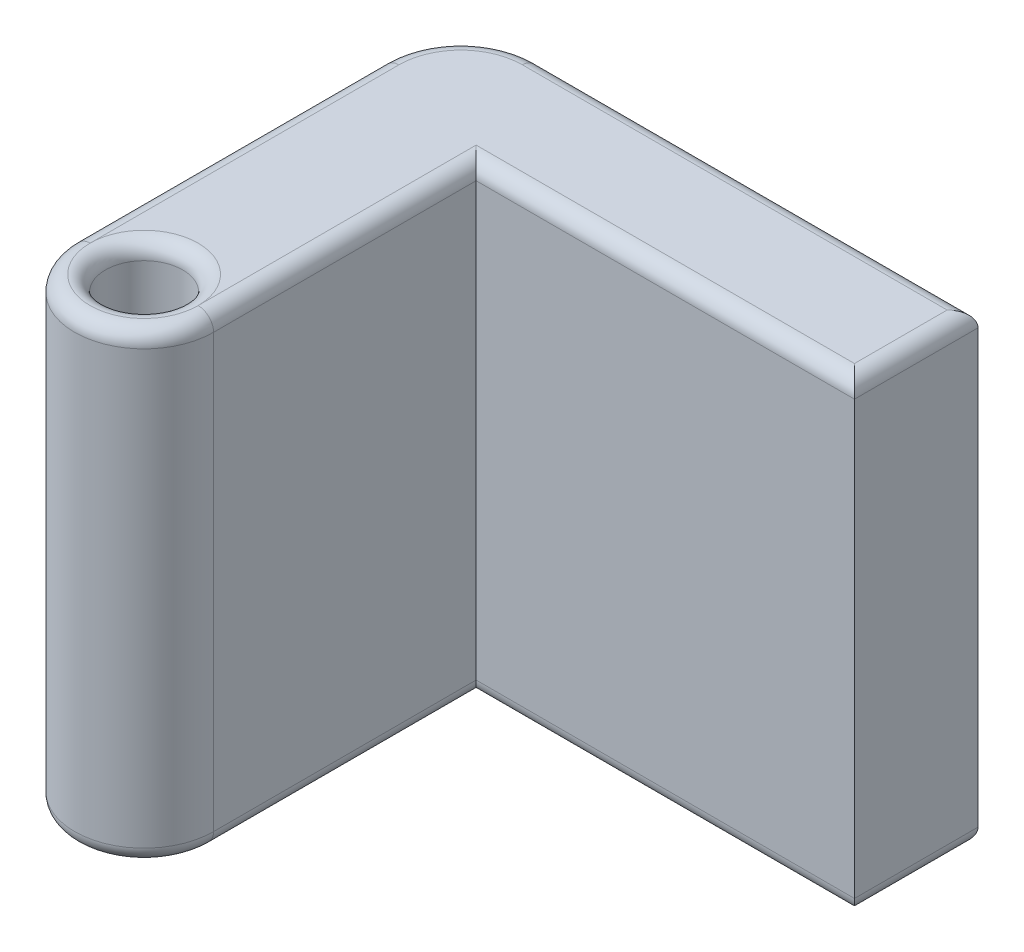
ISO-10303-21;
HEADER;
FILE_DESCRIPTION(('STEP AP214'),'2;1');
FILE_NAME('part.step','',(''),(''),'','','');
FILE_SCHEMA(('AUTOMOTIVE_DESIGN { 1 0 10303 214 1 1 1 1 }'));
ENDSEC;
DATA;
#1=APPLICATION_CONTEXT('core data for automotive mechanical design processes');
#2=APPLICATION_PROTOCOL_DEFINITION('international standard','automotive_design',2000,#1);
#3=PRODUCT_CONTEXT('',#1,'mechanical');
#4=PRODUCT('Part','Part','',(#3));
#5=PRODUCT_RELATED_PRODUCT_CATEGORY('part','',(#4));
#6=PRODUCT_DEFINITION_FORMATION('','',#4);
#7=PRODUCT_DEFINITION_CONTEXT('part definition',#1,'design');
#8=PRODUCT_DEFINITION('design','',#6,#7);
#9=PRODUCT_DEFINITION_SHAPE('','',#8);
#10=(LENGTH_UNIT() NAMED_UNIT(*) SI_UNIT(.MILLI.,.METRE.));
#11=(NAMED_UNIT(*) PLANE_ANGLE_UNIT() SI_UNIT($,.RADIAN.));
#12=(NAMED_UNIT(*) SI_UNIT($,.STERADIAN.) SOLID_ANGLE_UNIT());
#13=UNCERTAINTY_MEASURE_WITH_UNIT(LENGTH_MEASURE(1.E-05),#10,'distance_accuracy_value','');
#14=(GEOMETRIC_REPRESENTATION_CONTEXT(3) GLOBAL_UNCERTAINTY_ASSIGNED_CONTEXT((#13)) GLOBAL_UNIT_ASSIGNED_CONTEXT((#10,
#11,#12)) REPRESENTATION_CONTEXT('',''));
#15=CARTESIAN_POINT('',(0.,0.,0.));
#16=DIRECTION('',(0.,0.,1.));
#17=DIRECTION('',(1.,0.,0.));
#18=AXIS2_PLACEMENT_3D('',#15,#16,#17);
#19=CARTESIAN_POINT('',(-29.,30.,25.));
#20=DIRECTION('',(0.,1.,0.));
#21=DIRECTION('',(0.,0.,1.));
#22=AXIS2_PLACEMENT_3D('',#19,#20,#21);
#23=PLANE('',#22);
#24=CARTESIAN_POINT('',(-28.5,30.,5.));
#25=DIRECTION('',(0.,1.,0.));
#26=DIRECTION('',(0.,0.,1.));
#27=AXIS2_PLACEMENT_3D('',#24,#25,#26);
#28=CIRCLE('',#27,4.);
#29=CARTESIAN_POINT('',(-32.5,30.,5.));
#30=VERTEX_POINT('',#29);
#31=CARTESIAN_POINT('',(-28.5,30.,1.));
#32=VERTEX_POINT('',#31);
#33=EDGE_CURVE('E218',#30,#32,#28,.F.);
#34=ORIENTED_EDGE('',*,*,#33,.F.);
#35=DIRECTION('',(0.,0.,1.));
#36=VECTOR('',#35,1.);
#37=CARTESIAN_POINT('',(-32.5,30.,25.));
#38=LINE('',#37,#36);
#39=CARTESIAN_POINT('',(-32.5,30.,25.));
#40=VERTEX_POINT('',#39);
#41=EDGE_CURVE('E254',#30,#40,#38,.T.);
#42=ORIENTED_EDGE('',*,*,#41,.T.);
#43=CARTESIAN_POINT('',(-29.,30.,25.));
#44=DIRECTION('',(0.,1.,0.));
#45=DIRECTION('',(0.,0.,1.));
#46=AXIS2_PLACEMENT_3D('',#43,#44,#45);
#47=CIRCLE('',#46,3.5);
#48=CARTESIAN_POINT('',(-25.5,30.,25.));
#49=VERTEX_POINT('',#48);
#50=EDGE_CURVE('E266',#40,#49,#47,.F.);
#51=ORIENTED_EDGE('',*,*,#50,.T.);
#52=DIRECTION('',(0.,0.,-1.));
#53=VECTOR('',#52,1.);
#54=CARTESIAN_POINT('',(-25.5,30.,8.));
#55=LINE('',#54,#53);
#56=CARTESIAN_POINT('',(-25.5,30.,7.));
#57=VERTEX_POINT('',#56);
#58=EDGE_CURVE('E212',#49,#57,#55,.T.);
#59=ORIENTED_EDGE('',*,*,#58,.T.);
#60=DIRECTION('',(1.,0.,0.));
#61=VECTOR('',#60,1.);
#62=CARTESIAN_POINT('',(0.,30.,7.));
#63=LINE('',#62,#61);
#64=CARTESIAN_POINT('',(-1.,30.,7.));
#65=VERTEX_POINT('',#64);
#66=EDGE_CURVE('E258',#57,#65,#63,.T.);
#67=ORIENTED_EDGE('',*,*,#66,.T.);
#68=DIRECTION('',(0.,0.,-1.));
#69=VECTOR('',#68,1.);
#70=CARTESIAN_POINT('',(-1.,30.,0.));
#71=LINE('',#70,#69);
#72=CARTESIAN_POINT('',(-1.,30.,1.));
#73=VERTEX_POINT('',#72);
#74=EDGE_CURVE('E251',#65,#73,#71,.T.);
#75=ORIENTED_EDGE('',*,*,#74,.T.);
#76=DIRECTION('',(-1.,0.,0.));
#77=VECTOR('',#76,1.);
#78=CARTESIAN_POINT('',(-33.5,30.,1.00000000000001));
#79=LINE('',#78,#77);
#80=EDGE_CURVE('E247',#73,#32,#79,.T.);
#81=ORIENTED_EDGE('',*,*,#80,.T.);
#82=EDGE_LOOP('',(#34,#42,#51,#59,#67,#75,#81));
#83=FACE_BOUND('',#82,.T.);
#84=ADVANCED_FACE('F41',(#83),#23,.T.);
#85=CARTESIAN_POINT('',(-29.,0.,25.));
#86=DIRECTION('',(0.,1.,0.));
#87=DIRECTION('',(0.,0.,1.));
#88=AXIS2_PLACEMENT_3D('',#85,#86,#87);
#89=PLANE('',#88);
#90=CARTESIAN_POINT('',(-28.5,0.,5.));
#91=DIRECTION('',(0.,1.,0.));
#92=DIRECTION('',(0.,0.,1.));
#93=AXIS2_PLACEMENT_3D('',#90,#91,#92);
#94=CIRCLE('',#93,4.);
#95=CARTESIAN_POINT('',(-28.5,0.,1.));
#96=VERTEX_POINT('',#95);
#97=CARTESIAN_POINT('',(-32.5,0.,5.));
#98=VERTEX_POINT('',#97);
#99=EDGE_CURVE('E153',#96,#98,#94,.T.);
#100=ORIENTED_EDGE('',*,*,#99,.F.);
#101=DIRECTION('',(-1.,0.,0.));
#102=VECTOR('',#101,1.);
#103=CARTESIAN_POINT('',(-29.,0.,1.));
#104=LINE('',#103,#102);
#105=CARTESIAN_POINT('',(-1.,0.,1.));
#106=VERTEX_POINT('',#105);
#107=EDGE_CURVE('E146',#96,#106,#104,.F.);
#108=ORIENTED_EDGE('',*,*,#107,.T.);
#109=DIRECTION('',(0.,0.,-1.));
#110=VECTOR('',#109,1.);
#111=CARTESIAN_POINT('',(-1.,0.,25.));
#112=LINE('',#111,#110);
#113=CARTESIAN_POINT('',(-1.,0.,7.));
#114=VERTEX_POINT('',#113);
#115=EDGE_CURVE('E149',#106,#114,#112,.F.);
#116=ORIENTED_EDGE('',*,*,#115,.T.);
#117=DIRECTION('',(1.,0.,0.));
#118=VECTOR('',#117,1.);
#119=CARTESIAN_POINT('',(-29.,0.,7.));
#120=LINE('',#119,#118);
#121=CARTESIAN_POINT('',(-25.5,0.,7.));
#122=VERTEX_POINT('',#121);
#123=EDGE_CURVE('E168',#114,#122,#120,.F.);
#124=ORIENTED_EDGE('',*,*,#123,.T.);
#125=DIRECTION('',(0.,0.,-1.));
#126=VECTOR('',#125,1.);
#127=CARTESIAN_POINT('',(-25.5,0.,25.));
#128=LINE('',#127,#126);
#129=CARTESIAN_POINT('',(-25.5,0.,25.));
#130=VERTEX_POINT('',#129);
#131=EDGE_CURVE('E157',#122,#130,#128,.F.);
#132=ORIENTED_EDGE('',*,*,#131,.T.);
#133=CARTESIAN_POINT('',(-29.,0.,25.));
#134=DIRECTION('',(0.,1.,0.));
#135=DIRECTION('',(0.,0.,1.));
#136=AXIS2_PLACEMENT_3D('',#133,#134,#135);
#137=CIRCLE('',#136,3.5);
#138=CARTESIAN_POINT('',(-32.5,0.,25.));
#139=VERTEX_POINT('',#138);
#140=EDGE_CURVE('E156',#130,#139,#137,.T.);
#141=ORIENTED_EDGE('',*,*,#140,.T.);
#142=DIRECTION('',(0.,0.,1.));
#143=VECTOR('',#142,1.);
#144=CARTESIAN_POINT('',(-32.5,0.,25.));
#145=LINE('',#144,#143);
#146=EDGE_CURVE('E331',#139,#98,#145,.F.);
#147=ORIENTED_EDGE('',*,*,#146,.T.);
#148=EDGE_LOOP('',(#100,#108,#116,#124,#132,#141,#147));
#149=FACE_BOUND('',#148,.T.);
#150=ADVANCED_FACE('F148',(#149),#89,.F.);
#151=CARTESIAN_POINT('',(0.,30.,8.));
#152=DIRECTION('',(-1.,0.,0.));
#153=DIRECTION('',(0.,0.,1.));
#154=AXIS2_PLACEMENT_3D('',#151,#152,#153);
#155=PLANE('',#154);
#156=DIRECTION('',(0.,-1.,0.));
#157=VECTOR('',#156,1.);
#158=CARTESIAN_POINT('',(0.,30.,8.));
#159=LINE('',#158,#157);
#160=CARTESIAN_POINT('',(0.,29.,8.));
#161=VERTEX_POINT('',#160);
#162=CARTESIAN_POINT('',(0.,1.,8.));
#163=VERTEX_POINT('',#162);
#164=EDGE_CURVE('E174',#161,#163,#159,.T.);
#165=ORIENTED_EDGE('',*,*,#164,.T.);
#166=DIRECTION('',(0.,0.,-1.));
#167=VECTOR('',#166,1.);
#168=CARTESIAN_POINT('',(0.,1.,8.));
#169=LINE('',#168,#167);
#170=CARTESIAN_POINT('',(0.,1.,0.));
#171=VERTEX_POINT('',#170);
#172=EDGE_CURVE('E260',#163,#171,#169,.T.);
#173=ORIENTED_EDGE('',*,*,#172,.T.);
#174=DIRECTION('',(0.,-1.,0.));
#175=VECTOR('',#174,1.);
#176=CARTESIAN_POINT('',(0.,30.,0.));
#177=LINE('',#176,#175);
#178=CARTESIAN_POINT('',(0.,29.,0.));
#179=VERTEX_POINT('',#178);
#180=EDGE_CURVE('E169',#179,#171,#177,.T.);
#181=ORIENTED_EDGE('',*,*,#180,.F.);
#182=DIRECTION('',(0.,0.,-1.));
#183=VECTOR('',#182,1.);
#184=CARTESIAN_POINT('',(0.,29.,8.));
#185=LINE('',#184,#183);
#186=EDGE_CURVE('E298',#179,#161,#185,.F.);
#187=ORIENTED_EDGE('',*,*,#186,.T.);
#188=EDGE_LOOP('',(#165,#173,#181,#187));
#189=FACE_BOUND('',#188,.T.);
#190=ADVANCED_FACE('F311',(#189),#155,.F.);
#191=CARTESIAN_POINT('',(0.,30.,0.));
#192=DIRECTION('',(0.,0.,1.));
#193=DIRECTION('',(1.,0.,0.));
#194=AXIS2_PLACEMENT_3D('',#191,#192,#193);
#195=PLANE('',#194);
#196=DIRECTION('',(-1.,0.,0.));
#197=VECTOR('',#196,1.);
#198=CARTESIAN_POINT('',(0.,1.,0.));
#199=LINE('',#198,#197);
#200=CARTESIAN_POINT('',(-28.5,1.,0.));
#201=VERTEX_POINT('',#200);
#202=EDGE_CURVE('E172',#171,#201,#199,.T.);
#203=ORIENTED_EDGE('',*,*,#202,.T.);
#204=DIRECTION('',(0.,-1.,0.));
#205=VECTOR('',#204,1.);
#206=CARTESIAN_POINT('',(-28.5,30.,0.));
#207=LINE('',#206,#205);
#208=CARTESIAN_POINT('',(-28.5,29.,0.));
#209=VERTEX_POINT('',#208);
#210=EDGE_CURVE('E11',#201,#209,#207,.F.);
#211=ORIENTED_EDGE('',*,*,#210,.T.);
#212=DIRECTION('',(-1.,0.,0.));
#213=VECTOR('',#212,1.);
#214=CARTESIAN_POINT('',(0.,29.,0.));
#215=LINE('',#214,#213);
#216=EDGE_CURVE('E248',#209,#179,#215,.F.);
#217=ORIENTED_EDGE('',*,*,#216,.T.);
#218=ORIENTED_EDGE('',*,*,#180,.T.);
#219=EDGE_LOOP('',(#203,#211,#217,#218));
#220=FACE_BOUND('',#219,.T.);
#221=ADVANCED_FACE('F314',(#220),#195,.F.);
#222=CARTESIAN_POINT('',(-33.5,30.,0.));
#223=DIRECTION('',(1.,0.,0.));
#224=DIRECTION('',(0.,0.,-1.));
#225=AXIS2_PLACEMENT_3D('',#222,#223,#224);
#226=PLANE('',#225);
#227=DIRECTION('',(0.,0.,1.));
#228=VECTOR('',#227,1.);
#229=CARTESIAN_POINT('',(-33.5,29.,0.));
#230=LINE('',#229,#228);
#231=CARTESIAN_POINT('',(-33.5,29.,25.));
#232=VERTEX_POINT('',#231);
#233=CARTESIAN_POINT('',(-33.5,29.,5.));
#234=VERTEX_POINT('',#233);
#235=EDGE_CURVE('E346',#232,#234,#230,.F.);
#236=ORIENTED_EDGE('',*,*,#235,.T.);
#237=DIRECTION('',(0.,-1.,0.));
#238=VECTOR('',#237,1.);
#239=CARTESIAN_POINT('',(-33.5,30.,5.));
#240=LINE('',#239,#238);
#241=CARTESIAN_POINT('',(-33.5,1.,5.));
#242=VERTEX_POINT('',#241);
#243=EDGE_CURVE('E51',#234,#242,#240,.T.);
#244=ORIENTED_EDGE('',*,*,#243,.T.);
#245=DIRECTION('',(0.,0.,1.));
#246=VECTOR('',#245,1.);
#247=CARTESIAN_POINT('',(-33.5,1.,0.));
#248=LINE('',#247,#246);
#249=CARTESIAN_POINT('',(-33.5,1.,25.));
#250=VERTEX_POINT('',#249);
#251=EDGE_CURVE('E349',#242,#250,#248,.T.);
#252=ORIENTED_EDGE('',*,*,#251,.T.);
#253=DIRECTION('',(0.,-1.,0.));
#254=VECTOR('',#253,1.);
#255=CARTESIAN_POINT('',(-33.5,30.,25.));
#256=LINE('',#255,#254);
#257=EDGE_CURVE('E316',#232,#250,#256,.T.);
#258=ORIENTED_EDGE('',*,*,#257,.F.);
#259=EDGE_LOOP('',(#236,#244,#252,#258));
#260=FACE_BOUND('',#259,.T.);
#261=ADVANCED_FACE('F398',(#260),#226,.F.);
#262=CARTESIAN_POINT('',(-29.,30.,25.));
#263=DIRECTION('',(0.,-1.,0.));
#264=DIRECTION('',(0.,0.,-1.));
#265=AXIS2_PLACEMENT_3D('',#262,#263,#264);
#266=CYLINDRICAL_SURFACE('',#265,4.5);
#267=ORIENTED_EDGE('',*,*,#257,.T.);
#268=CARTESIAN_POINT('',(-29.,1.,25.));
#269=DIRECTION('',(0.,1.,0.));
#270=DIRECTION('',(0.,0.,1.));
#271=AXIS2_PLACEMENT_3D('',#268,#269,#270);
#272=CIRCLE('',#271,4.5);
#273=CARTESIAN_POINT('',(-24.5,1.,25.));
#274=VERTEX_POINT('',#273);
#275=EDGE_CURVE('E355',#250,#274,#272,.T.);
#276=ORIENTED_EDGE('',*,*,#275,.T.);
#277=DIRECTION('',(0.,-1.,0.));
#278=VECTOR('',#277,1.);
#279=CARTESIAN_POINT('',(-24.5,30.,25.));
#280=LINE('',#279,#278);
#281=CARTESIAN_POINT('',(-24.5,29.,25.));
#282=VERTEX_POINT('',#281);
#283=EDGE_CURVE('E320',#282,#274,#280,.T.);
#284=ORIENTED_EDGE('',*,*,#283,.F.);
#285=CARTESIAN_POINT('',(-29.,29.,25.));
#286=DIRECTION('',(0.,1.,0.));
#287=DIRECTION('',(0.,0.,1.));
#288=AXIS2_PLACEMENT_3D('',#285,#286,#287);
#289=CIRCLE('',#288,4.5);
#290=EDGE_CURVE('E352',#282,#232,#289,.F.);
#291=ORIENTED_EDGE('',*,*,#290,.T.);
#292=EDGE_LOOP('',(#267,#276,#284,#291));
#293=FACE_BOUND('',#292,.T.);
#294=ADVANCED_FACE('F382',(#293),#266,.T.);
#295=CARTESIAN_POINT('',(-24.5,30.,25.));
#296=DIRECTION('',(-1.,0.,0.));
#297=DIRECTION('',(0.,0.,1.));
#298=AXIS2_PLACEMENT_3D('',#295,#296,#297);
#299=PLANE('',#298);
#300=ORIENTED_EDGE('',*,*,#283,.T.);
#301=DIRECTION('',(0.,0.,-1.));
#302=VECTOR('',#301,1.);
#303=CARTESIAN_POINT('',(-24.5,1.,25.));
#304=LINE('',#303,#302);
#305=CARTESIAN_POINT('',(-24.5,1.,8.));
#306=VERTEX_POINT('',#305);
#307=EDGE_CURVE('E289',#274,#306,#304,.T.);
#308=ORIENTED_EDGE('',*,*,#307,.T.);
#309=DIRECTION('',(0.,-1.,0.));
#310=VECTOR('',#309,1.);
#311=CARTESIAN_POINT('',(-24.5,30.,8.));
#312=LINE('',#311,#310);
#313=CARTESIAN_POINT('',(-24.5,29.,8.));
#314=VERTEX_POINT('',#313);
#315=EDGE_CURVE('E179',#314,#306,#312,.T.);
#316=ORIENTED_EDGE('',*,*,#315,.F.);
#317=DIRECTION('',(0.,0.,-1.));
#318=VECTOR('',#317,1.);
#319=CARTESIAN_POINT('',(-24.5,29.,25.));
#320=LINE('',#319,#318);
#321=EDGE_CURVE('E358',#314,#282,#320,.F.);
#322=ORIENTED_EDGE('',*,*,#321,.T.);
#323=EDGE_LOOP('',(#300,#308,#316,#322));
#324=FACE_BOUND('',#323,.T.);
#325=ADVANCED_FACE('F364',(#324),#299,.F.);
#326=CARTESIAN_POINT('',(-24.5,30.,8.));
#327=DIRECTION('',(0.,0.,-1.));
#328=DIRECTION('',(-1.,0.,0.));
#329=AXIS2_PLACEMENT_3D('',#326,#327,#328);
#330=PLANE('',#329);
#331=ORIENTED_EDGE('',*,*,#315,.T.);
#332=DIRECTION('',(1.,0.,0.));
#333=VECTOR('',#332,1.);
#334=CARTESIAN_POINT('',(-24.5,1.,8.));
#335=LINE('',#334,#333);
#336=EDGE_CURVE('E293',#306,#163,#335,.T.);
#337=ORIENTED_EDGE('',*,*,#336,.T.);
#338=ORIENTED_EDGE('',*,*,#164,.F.);
#339=DIRECTION('',(1.,0.,0.));
#340=VECTOR('',#339,1.);
#341=CARTESIAN_POINT('',(-24.5,29.,8.));
#342=LINE('',#341,#340);
#343=EDGE_CURVE('E299',#161,#314,#342,.F.);
#344=ORIENTED_EDGE('',*,*,#343,.T.);
#345=EDGE_LOOP('',(#331,#337,#338,#344));
#346=FACE_BOUND('',#345,.T.);
#347=ADVANCED_FACE('F366',(#346),#330,.F.);
#348=CARTESIAN_POINT('',(-29.,30.,25.));
#349=DIRECTION('',(0.,-1.,0.));
#350=DIRECTION('',(0.,0.,-1.));
#351=AXIS2_PLACEMENT_3D('',#348,#349,#350);
#352=CYLINDRICAL_SURFACE('',#351,2.5);
#353=CARTESIAN_POINT('',(-29.,1.,25.));
#354=DIRECTION('',(0.,1.,0.));
#355=DIRECTION('',(0.,0.,1.));
#356=AXIS2_PLACEMENT_3D('',#353,#354,#355);
#357=CIRCLE('',#356,2.5);
#358=CARTESIAN_POINT('',(-29.,1.,27.5));
#359=VERTEX_POINT('',#358);
#360=EDGE_CURVE('E338',#359,#359,#357,.F.);
#361=ORIENTED_EDGE('',*,*,#360,.T.);
#362=EDGE_LOOP('',(#361));
#363=FACE_BOUND('',#362,.T.);
#364=CARTESIAN_POINT('',(-29.,29.,25.));
#365=DIRECTION('',(0.,1.,0.));
#366=DIRECTION('',(0.,0.,1.));
#367=AXIS2_PLACEMENT_3D('',#364,#365,#366);
#368=CIRCLE('',#367,2.5);
#369=CARTESIAN_POINT('',(-29.,29.,27.5));
#370=VERTEX_POINT('',#369);
#371=EDGE_CURVE('E334',#370,#370,#368,.T.);
#372=ORIENTED_EDGE('',*,*,#371,.T.);
#373=EDGE_LOOP('',(#372));
#374=FACE_BOUND('',#373,.T.);
#375=ADVANCED_FACE('F427',(#363,#374),#352,.F.);
#376=CARTESIAN_POINT('',(-1.,1.,8.));
#377=DIRECTION('',(0.,0.,-1.));
#378=DIRECTION('',(-1.,0.,0.));
#379=AXIS2_PLACEMENT_3D('',#376,#377,#378);
#380=CYLINDRICAL_SURFACE('',#379,1.);
#381=CARTESIAN_POINT('',(-1.,1.,7.));
#382=DIRECTION('',(0.707106781186547,0.,-0.707106781186547));
#383=DIRECTION('',(-0.707106781186547,0.,-0.707106781186547));
#384=AXIS2_PLACEMENT_3D('',#381,#382,#383);
#385=ELLIPSE('',#384,1.41421356237309,1.);
#386=EDGE_CURVE('E165',#114,#163,#385,.F.);
#387=ORIENTED_EDGE('',*,*,#386,.F.);
#388=ORIENTED_EDGE('',*,*,#115,.F.);
#389=CARTESIAN_POINT('',(-1.,1.,1.));
#390=DIRECTION('',(-0.707106781186548,0.,-0.707106781186547));
#391=DIRECTION('',(0.707106781186547,0.,-0.707106781186548));
#392=AXIS2_PLACEMENT_3D('',#389,#390,#391);
#393=ELLIPSE('',#392,1.4142135623731,1.);
#394=EDGE_CURVE('E163',#171,#106,#393,.T.);
#395=ORIENTED_EDGE('',*,*,#394,.F.);
#396=ORIENTED_EDGE('',*,*,#172,.F.);
#397=EDGE_LOOP('',(#387,#388,#395,#396));
#398=FACE_BOUND('',#397,.T.);
#399=ADVANCED_FACE('F161',(#398),#380,.T.);
#400=CARTESIAN_POINT('',(0.,1.,1.));
#401=DIRECTION('',(-1.,0.,0.));
#402=DIRECTION('',(0.,0.,1.));
#403=AXIS2_PLACEMENT_3D('',#400,#401,#402);
#404=CYLINDRICAL_SURFACE('',#403,1.);
#405=ORIENTED_EDGE('',*,*,#107,.F.);
#406=CARTESIAN_POINT('',(-28.5,1.,1.));
#407=DIRECTION('',(1.,0.,0.));
#408=DIRECTION('',(0.,0.,-1.));
#409=AXIS2_PLACEMENT_3D('',#406,#407,#408);
#410=CIRCLE('',#409,1.);
#411=EDGE_CURVE('E59',#96,#201,#410,.T.);
#412=ORIENTED_EDGE('',*,*,#411,.T.);
#413=ORIENTED_EDGE('',*,*,#202,.F.);
#414=ORIENTED_EDGE('',*,*,#394,.T.);
#415=EDGE_LOOP('',(#405,#412,#413,#414));
#416=FACE_BOUND('',#415,.T.);
#417=ADVANCED_FACE('F171',(#416),#404,.T.);
#418=CARTESIAN_POINT('',(-24.5,1.,7.));
#419=DIRECTION('',(1.,0.,0.));
#420=DIRECTION('',(0.,0.,-1.));
#421=AXIS2_PLACEMENT_3D('',#418,#419,#420);
#422=CYLINDRICAL_SURFACE('',#421,1.);
#423=ORIENTED_EDGE('',*,*,#386,.T.);
#424=ORIENTED_EDGE('',*,*,#336,.F.);
#425=CARTESIAN_POINT('',(-25.5,1.,7.));
#426=DIRECTION('',(0.707106781186547,0.,-0.707106781186547));
#427=DIRECTION('',(-0.707106781186547,0.,-0.707106781186547));
#428=AXIS2_PLACEMENT_3D('',#425,#426,#427);
#429=ELLIPSE('',#428,1.41421356237309,1.);
#430=EDGE_CURVE('E181',#122,#306,#429,.F.);
#431=ORIENTED_EDGE('',*,*,#430,.F.);
#432=ORIENTED_EDGE('',*,*,#123,.F.);
#433=EDGE_LOOP('',(#423,#424,#431,#432));
#434=FACE_BOUND('',#433,.T.);
#435=ADVANCED_FACE('F292',(#434),#422,.T.);
#436=CARTESIAN_POINT('',(-32.5,1.,0.));
#437=DIRECTION('',(0.,0.,1.));
#438=DIRECTION('',(1.,0.,0.));
#439=AXIS2_PLACEMENT_3D('',#436,#437,#438);
#440=CYLINDRICAL_SURFACE('',#439,1.);
#441=ORIENTED_EDGE('',*,*,#251,.F.);
#442=CARTESIAN_POINT('',(-32.5,1.,5.));
#443=DIRECTION('',(0.,0.,1.));
#444=DIRECTION('',(1.,0.,0.));
#445=AXIS2_PLACEMENT_3D('',#442,#443,#444);
#446=CIRCLE('',#445,1.);
#447=EDGE_CURVE('E211',#242,#98,#446,.T.);
#448=ORIENTED_EDGE('',*,*,#447,.T.);
#449=ORIENTED_EDGE('',*,*,#146,.F.);
#450=CARTESIAN_POINT('',(-32.5,1.,25.));
#451=DIRECTION('',(0.,0.,1.));
#452=DIRECTION('',(1.,0.,0.));
#453=AXIS2_PLACEMENT_3D('',#450,#451,#452);
#454=CIRCLE('',#453,1.);
#455=EDGE_CURVE('E278',#250,#139,#454,.T.);
#456=ORIENTED_EDGE('',*,*,#455,.F.);
#457=EDGE_LOOP('',(#441,#448,#449,#456));
#458=FACE_BOUND('',#457,.T.);
#459=ADVANCED_FACE('F396',(#458),#440,.T.);
#460=CARTESIAN_POINT('',(-25.5,1.,25.));
#461=DIRECTION('',(0.,0.,-1.));
#462=DIRECTION('',(-1.,0.,0.));
#463=AXIS2_PLACEMENT_3D('',#460,#461,#462);
#464=CYLINDRICAL_SURFACE('',#463,1.);
#465=ORIENTED_EDGE('',*,*,#430,.T.);
#466=ORIENTED_EDGE('',*,*,#307,.F.);
#467=CARTESIAN_POINT('',(-25.5,1.,25.));
#468=DIRECTION('',(0.,0.,1.));
#469=DIRECTION('',(1.,0.,0.));
#470=AXIS2_PLACEMENT_3D('',#467,#468,#469);
#471=CIRCLE('',#470,1.);
#472=EDGE_CURVE('E274',#130,#274,#471,.T.);
#473=ORIENTED_EDGE('',*,*,#472,.F.);
#474=ORIENTED_EDGE('',*,*,#131,.F.);
#475=EDGE_LOOP('',(#465,#466,#473,#474));
#476=FACE_BOUND('',#475,.T.);
#477=ADVANCED_FACE('F287',(#476),#464,.T.);
#478=CARTESIAN_POINT('',(-29.,1.,25.));
#479=DIRECTION('',(0.,1.,0.));
#480=DIRECTION('',(0.,0.,1.));
#481=AXIS2_PLACEMENT_3D('',#478,#479,#480);
#482=TOROIDAL_SURFACE('',#481,3.5,1.);
#483=CARTESIAN_POINT('',(-29.,0.,25.));
#484=DIRECTION('',(0.,1.,0.));
#485=DIRECTION('',(0.,0.,1.));
#486=AXIS2_PLACEMENT_3D('',#483,#484,#485);
#487=CIRCLE('',#486,3.5);
#488=EDGE_CURVE('E208',#130,#139,#487,.F.);
#489=ORIENTED_EDGE('',*,*,#488,.F.);
#490=ORIENTED_EDGE('',*,*,#472,.T.);
#491=ORIENTED_EDGE('',*,*,#275,.F.);
#492=ORIENTED_EDGE('',*,*,#455,.T.);
#493=EDGE_LOOP('',(#489,#490,#491,#492));
#494=FACE_BOUND('',#493,.T.);
#495=ADVANCED_FACE('F388',(#494),#482,.T.);
#496=CARTESIAN_POINT('',(-29.,1.,25.));
#497=DIRECTION('',(0.,1.,0.));
#498=DIRECTION('',(0.,0.,1.));
#499=AXIS2_PLACEMENT_3D('',#496,#497,#498);
#500=TOROIDAL_SURFACE('',#499,3.5,1.);
#501=ORIENTED_EDGE('',*,*,#360,.F.);
#502=EDGE_LOOP('',(#501));
#503=FACE_BOUND('',#502,.T.);
#504=ORIENTED_EDGE('',*,*,#140,.F.);
#505=ORIENTED_EDGE('',*,*,#488,.T.);
#506=EDGE_LOOP('',(#504,#505));
#507=FACE_BOUND('',#506,.T.);
#508=ADVANCED_FACE('F392',(#503,#507),#500,.T.);
#509=CARTESIAN_POINT('',(-1.,29.,25.));
#510=DIRECTION('',(0.,0.,1.));
#511=DIRECTION('',(1.,0.,0.));
#512=AXIS2_PLACEMENT_3D('',#509,#510,#511);
#513=CYLINDRICAL_SURFACE('',#512,1.);
#514=CARTESIAN_POINT('',(-1.,29.,1.));
#515=DIRECTION('',(0.707106781186548,0.,0.707106781186547));
#516=DIRECTION('',(-0.707106781186547,0.,0.707106781186548));
#517=AXIS2_PLACEMENT_3D('',#514,#515,#516);
#518=ELLIPSE('',#517,1.4142135623731,1.);
#519=EDGE_CURVE('E200',#73,#179,#518,.F.);
#520=ORIENTED_EDGE('',*,*,#519,.F.);
#521=ORIENTED_EDGE('',*,*,#74,.F.);
#522=CARTESIAN_POINT('',(-1.,29.,7.));
#523=DIRECTION('',(-0.707106781186547,0.,0.707106781186547));
#524=DIRECTION('',(0.707106781186547,0.,0.707106781186547));
#525=AXIS2_PLACEMENT_3D('',#522,#523,#524);
#526=ELLIPSE('',#525,1.41421356237309,1.);
#527=EDGE_CURVE('E204',#161,#65,#526,.T.);
#528=ORIENTED_EDGE('',*,*,#527,.F.);
#529=ORIENTED_EDGE('',*,*,#186,.F.);
#530=EDGE_LOOP('',(#520,#521,#528,#529));
#531=FACE_BOUND('',#530,.T.);
#532=ADVANCED_FACE('F409',(#531),#513,.T.);
#533=CARTESIAN_POINT('',(-29.,29.,7.));
#534=DIRECTION('',(-1.,0.,0.));
#535=DIRECTION('',(0.,0.,1.));
#536=AXIS2_PLACEMENT_3D('',#533,#534,#535);
#537=CYLINDRICAL_SURFACE('',#536,1.);
#538=ORIENTED_EDGE('',*,*,#527,.T.);
#539=ORIENTED_EDGE('',*,*,#66,.F.);
#540=CARTESIAN_POINT('',(-25.5,29.,7.));
#541=DIRECTION('',(-0.707106781186547,0.,0.707106781186547));
#542=DIRECTION('',(-0.707106781186547,0.,-0.707106781186547));
#543=AXIS2_PLACEMENT_3D('',#540,#541,#542);
#544=ELLIPSE('',#543,1.41421356237309,1.);
#545=EDGE_CURVE('E196',#314,#57,#544,.T.);
#546=ORIENTED_EDGE('',*,*,#545,.F.);
#547=ORIENTED_EDGE('',*,*,#343,.F.);
#548=EDGE_LOOP('',(#538,#539,#546,#547));
#549=FACE_BOUND('',#548,.T.);
#550=ADVANCED_FACE('F374',(#549),#537,.T.);
#551=CARTESIAN_POINT('',(-29.,29.,1.));
#552=DIRECTION('',(1.,0.,0.));
#553=DIRECTION('',(0.,0.,-1.));
#554=AXIS2_PLACEMENT_3D('',#551,#552,#553);
#555=CYLINDRICAL_SURFACE('',#554,1.);
#556=ORIENTED_EDGE('',*,*,#216,.F.);
#557=CARTESIAN_POINT('',(-28.5,29.,1.));
#558=DIRECTION('',(1.,0.,0.));
#559=DIRECTION('',(0.,0.,-1.));
#560=AXIS2_PLACEMENT_3D('',#557,#558,#559);
#561=CIRCLE('',#560,1.);
#562=EDGE_CURVE('E215',#209,#32,#561,.T.);
#563=ORIENTED_EDGE('',*,*,#562,.T.);
#564=ORIENTED_EDGE('',*,*,#80,.F.);
#565=ORIENTED_EDGE('',*,*,#519,.T.);
#566=EDGE_LOOP('',(#556,#563,#564,#565));
#567=FACE_BOUND('',#566,.T.);
#568=ADVANCED_FACE('F246',(#567),#555,.T.);
#569=CARTESIAN_POINT('',(-25.5,29.,25.));
#570=DIRECTION('',(0.,0.,1.));
#571=DIRECTION('',(1.,0.,0.));
#572=AXIS2_PLACEMENT_3D('',#569,#570,#571);
#573=CYLINDRICAL_SURFACE('',#572,1.);
#574=ORIENTED_EDGE('',*,*,#545,.T.);
#575=ORIENTED_EDGE('',*,*,#58,.F.);
#576=CARTESIAN_POINT('',(-25.5,29.,25.));
#577=DIRECTION('',(0.,0.,1.));
#578=DIRECTION('',(1.,0.,0.));
#579=AXIS2_PLACEMENT_3D('',#576,#577,#578);
#580=CIRCLE('',#579,1.);
#581=EDGE_CURVE('E192',#282,#49,#580,.T.);
#582=ORIENTED_EDGE('',*,*,#581,.F.);
#583=ORIENTED_EDGE('',*,*,#321,.F.);
#584=EDGE_LOOP('',(#574,#575,#582,#583));
#585=FACE_BOUND('',#584,.T.);
#586=ADVANCED_FACE('F378',(#585),#573,.T.);
#587=CARTESIAN_POINT('',(-32.5,29.,25.));
#588=DIRECTION('',(0.,0.,-1.));
#589=DIRECTION('',(-1.,0.,0.));
#590=AXIS2_PLACEMENT_3D('',#587,#588,#589);
#591=CYLINDRICAL_SURFACE('',#590,1.);
#592=ORIENTED_EDGE('',*,*,#41,.F.);
#593=CARTESIAN_POINT('',(-32.5,29.,5.));
#594=DIRECTION('',(0.,0.,1.));
#595=DIRECTION('',(1.,0.,0.));
#596=AXIS2_PLACEMENT_3D('',#593,#594,#595);
#597=CIRCLE('',#596,1.);
#598=EDGE_CURVE('E67',#30,#234,#597,.T.);
#599=ORIENTED_EDGE('',*,*,#598,.T.);
#600=ORIENTED_EDGE('',*,*,#235,.F.);
#601=CARTESIAN_POINT('',(-32.5,29.,25.));
#602=DIRECTION('',(0.,0.,1.));
#603=DIRECTION('',(1.,0.,0.));
#604=AXIS2_PLACEMENT_3D('',#601,#602,#603);
#605=CIRCLE('',#604,1.);
#606=EDGE_CURVE('E188',#40,#232,#605,.T.);
#607=ORIENTED_EDGE('',*,*,#606,.F.);
#608=EDGE_LOOP('',(#592,#599,#600,#607));
#609=FACE_BOUND('',#608,.T.);
#610=ADVANCED_FACE('F400',(#609),#591,.T.);
#611=CARTESIAN_POINT('',(-29.,29.,25.));
#612=DIRECTION('',(0.,1.,0.));
#613=DIRECTION('',(0.,0.,1.));
#614=AXIS2_PLACEMENT_3D('',#611,#612,#613);
#615=TOROIDAL_SURFACE('',#614,3.5,1.);
#616=CARTESIAN_POINT('',(-29.,30.,25.));
#617=DIRECTION('',(0.,1.,0.));
#618=DIRECTION('',(0.,0.,1.));
#619=AXIS2_PLACEMENT_3D('',#616,#617,#618);
#620=CIRCLE('',#619,3.5);
#621=EDGE_CURVE('E185',#40,#49,#620,.T.);
#622=ORIENTED_EDGE('',*,*,#621,.F.);
#623=ORIENTED_EDGE('',*,*,#606,.T.);
#624=ORIENTED_EDGE('',*,*,#290,.F.);
#625=ORIENTED_EDGE('',*,*,#581,.T.);
#626=EDGE_LOOP('',(#622,#623,#624,#625));
#627=FACE_BOUND('',#626,.T.);
#628=ADVANCED_FACE('F403',(#627),#615,.T.);
#629=CARTESIAN_POINT('',(-29.,29.,25.));
#630=DIRECTION('',(0.,1.,0.));
#631=DIRECTION('',(0.,0.,1.));
#632=AXIS2_PLACEMENT_3D('',#629,#630,#631);
#633=TOROIDAL_SURFACE('',#632,3.5,1.);
#634=ORIENTED_EDGE('',*,*,#50,.F.);
#635=ORIENTED_EDGE('',*,*,#621,.T.);
#636=EDGE_LOOP('',(#634,#635));
#637=FACE_BOUND('',#636,.T.);
#638=ORIENTED_EDGE('',*,*,#371,.F.);
#639=EDGE_LOOP('',(#638));
#640=FACE_BOUND('',#639,.T.);
#641=ADVANCED_FACE('F406',(#637,#640),#633,.T.);
#642=CARTESIAN_POINT('',(-28.5,29.,5.));
#643=DIRECTION('',(0.,1.,0.));
#644=DIRECTION('',(0.,0.,1.));
#645=AXIS2_PLACEMENT_3D('',#642,#643,#644);
#646=TOROIDAL_SURFACE('',#645,4.,1.);
#647=ORIENTED_EDGE('',*,*,#33,.T.);
#648=ORIENTED_EDGE('',*,*,#562,.F.);
#649=CARTESIAN_POINT('',(-28.5,29.,5.));
#650=DIRECTION('',(0.,1.,0.));
#651=DIRECTION('',(0.,0.,1.));
#652=AXIS2_PLACEMENT_3D('',#649,#650,#651);
#653=CIRCLE('',#652,5.);
#654=EDGE_CURVE('E45',#234,#209,#653,.F.);
#655=ORIENTED_EDGE('',*,*,#654,.F.);
#656=ORIENTED_EDGE('',*,*,#598,.F.);
#657=EDGE_LOOP('',(#647,#648,#655,#656));
#658=FACE_BOUND('',#657,.T.);
#659=ADVANCED_FACE('F43',(#658),#646,.T.);
#660=CARTESIAN_POINT('',(-28.5,30.,5.));
#661=DIRECTION('',(0.,-1.,0.));
#662=DIRECTION('',(0.,0.,-1.));
#663=AXIS2_PLACEMENT_3D('',#660,#661,#662);
#664=CYLINDRICAL_SURFACE('',#663,5.);
#665=ORIENTED_EDGE('',*,*,#654,.T.);
#666=ORIENTED_EDGE('',*,*,#210,.F.);
#667=CARTESIAN_POINT('',(-28.5,1.,5.));
#668=DIRECTION('',(0.,1.,0.));
#669=DIRECTION('',(0.,0.,1.));
#670=AXIS2_PLACEMENT_3D('',#667,#668,#669);
#671=CIRCLE('',#670,5.);
#672=EDGE_CURVE('E227',#242,#201,#671,.F.);
#673=ORIENTED_EDGE('',*,*,#672,.F.);
#674=ORIENTED_EDGE('',*,*,#243,.F.);
#675=EDGE_LOOP('',(#665,#666,#673,#674));
#676=FACE_BOUND('',#675,.T.);
#677=ADVANCED_FACE('F239',(#676),#664,.T.);
#678=CARTESIAN_POINT('',(-28.5,1.,5.));
#679=DIRECTION('',(0.,1.,0.));
#680=DIRECTION('',(0.,0.,1.));
#681=AXIS2_PLACEMENT_3D('',#678,#679,#680);
#682=TOROIDAL_SURFACE('',#681,4.,1.);
#683=ORIENTED_EDGE('',*,*,#411,.F.);
#684=ORIENTED_EDGE('',*,*,#99,.T.);
#685=ORIENTED_EDGE('',*,*,#447,.F.);
#686=ORIENTED_EDGE('',*,*,#672,.T.);
#687=EDGE_LOOP('',(#683,#684,#685,#686));
#688=FACE_BOUND('',#687,.T.);
#689=ADVANCED_FACE('F394',(#688),#682,.T.);
#690=CLOSED_SHELL('',(#84,#150,#190,#221,#261,#294,#325,#347,#375,#399,#417,#435,#459,#477,#495,
#508,#532,#550,#568,#586,#610,#628,#641,#659,#677,#689));
#691=MANIFOLD_SOLID_BREP('B2',#690);
#692=ADVANCED_BREP_SHAPE_REPRESENTATION('',(#18,#691),#14);
#693=SHAPE_DEFINITION_REPRESENTATION(#9,#692);
ENDSEC;
END-ISO-10303-21;
